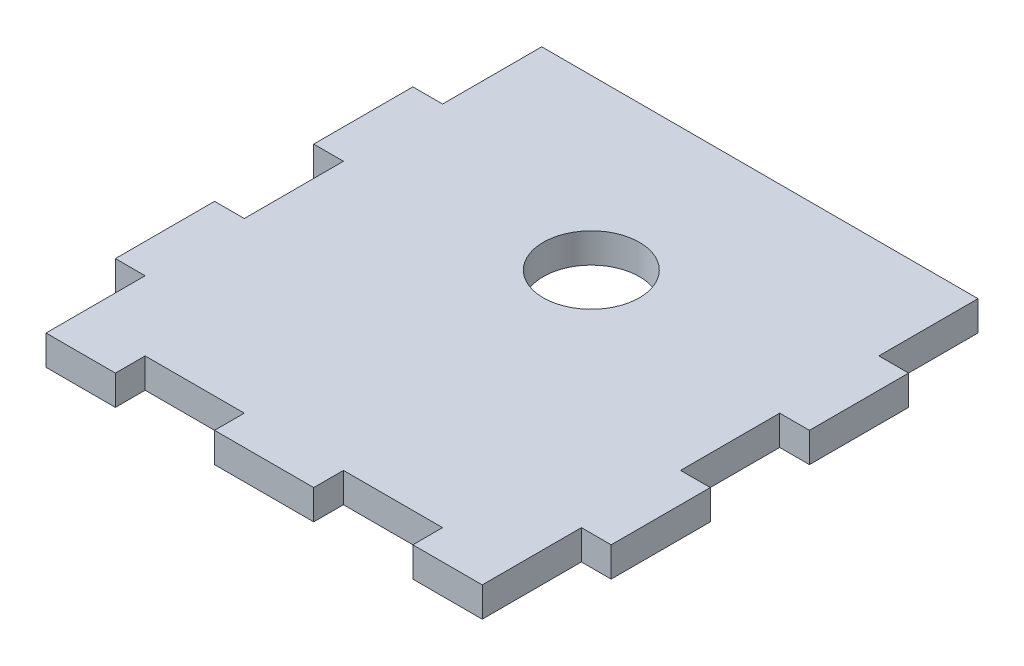
ISO-10303-21;
HEADER;
FILE_DESCRIPTION(('STEP AP214'),'2;1');
FILE_NAME('part.step','',(''),(''),'','','');
FILE_SCHEMA(('AUTOMOTIVE_DESIGN { 1 0 10303 214 1 1 1 1 }'));
ENDSEC;
DATA;
#1=APPLICATION_CONTEXT('core data for automotive mechanical design processes');
#2=APPLICATION_PROTOCOL_DEFINITION('international standard','automotive_design',2000,#1);
#3=PRODUCT_CONTEXT('',#1,'mechanical');
#4=PRODUCT('Part','Part','',(#3));
#5=PRODUCT_RELATED_PRODUCT_CATEGORY('part','',(#4));
#6=PRODUCT_DEFINITION_FORMATION('','',#4);
#7=PRODUCT_DEFINITION_CONTEXT('part definition',#1,'design');
#8=PRODUCT_DEFINITION('design','',#6,#7);
#9=PRODUCT_DEFINITION_SHAPE('','',#8);
#10=(LENGTH_UNIT() NAMED_UNIT(*) SI_UNIT(.MILLI.,.METRE.));
#11=(NAMED_UNIT(*) PLANE_ANGLE_UNIT() SI_UNIT($,.RADIAN.));
#12=(NAMED_UNIT(*) SI_UNIT($,.STERADIAN.) SOLID_ANGLE_UNIT());
#13=UNCERTAINTY_MEASURE_WITH_UNIT(LENGTH_MEASURE(1.E-05),#10,'distance_accuracy_value','');
#14=(GEOMETRIC_REPRESENTATION_CONTEXT(3) GLOBAL_UNCERTAINTY_ASSIGNED_CONTEXT((#13)) GLOBAL_UNIT_ASSIGNED_CONTEXT((#10,
#11,#12)) REPRESENTATION_CONTEXT('',''));
#15=CARTESIAN_POINT('',(0.,0.,0.));
#16=DIRECTION('',(0.,0.,1.));
#17=DIRECTION('',(1.,0.,0.));
#18=AXIS2_PLACEMENT_3D('',#15,#16,#17);
#19=CARTESIAN_POINT('',(40.,3.,0.));
#20=DIRECTION('',(1.,0.,0.));
#21=DIRECTION('',(0.,0.,-1.));
#22=AXIS2_PLACEMENT_3D('',#19,#20,#21);
#23=PLANE('',#22);
#24=DIRECTION('',(0.,0.,1.));
#25=VECTOR('',#24,1.);
#26=CARTESIAN_POINT('',(40.,0.,0.));
#27=LINE('',#26,#25);
#28=CARTESIAN_POINT('',(40.,0.,-3.));
#29=VERTEX_POINT('',#28);
#30=CARTESIAN_POINT('',(40.,0.,0.));
#31=VERTEX_POINT('',#30);
#32=EDGE_CURVE('E255',#29,#31,#27,.T.);
#33=ORIENTED_EDGE('',*,*,#32,.T.);
#34=DIRECTION('',(0.,-1.,0.));
#35=VECTOR('',#34,1.);
#36=CARTESIAN_POINT('',(40.,3.,0.));
#37=LINE('',#36,#35);
#38=CARTESIAN_POINT('',(40.,3.,0.));
#39=VERTEX_POINT('',#38);
#40=EDGE_CURVE('E11',#39,#31,#37,.T.);
#41=ORIENTED_EDGE('',*,*,#40,.F.);
#42=DIRECTION('',(0.,0.,1.));
#43=VECTOR('',#42,1.);
#44=CARTESIAN_POINT('',(40.,3.,0.));
#45=LINE('',#44,#43);
#46=CARTESIAN_POINT('',(40.,3.,-3.));
#47=VERTEX_POINT('',#46);
#48=EDGE_CURVE('E402',#47,#39,#45,.T.);
#49=ORIENTED_EDGE('',*,*,#48,.F.);
#50=DIRECTION('',(0.,-1.,0.));
#51=VECTOR('',#50,1.);
#52=CARTESIAN_POINT('',(40.,3.,-3.));
#53=LINE('',#52,#51);
#54=EDGE_CURVE('E251',#47,#29,#53,.T.);
#55=ORIENTED_EDGE('',*,*,#54,.T.);
#56=EDGE_LOOP('',(#33,#41,#49,#55));
#57=FACE_BOUND('',#56,.T.);
#58=ADVANCED_FACE('F33',(#57),#23,.F.);
#59=CARTESIAN_POINT('',(0.,3.,0.));
#60=DIRECTION('',(0.,0.,-1.));
#61=DIRECTION('',(-1.,0.,0.));
#62=AXIS2_PLACEMENT_3D('',#59,#60,#61);
#63=PLANE('',#62);
#64=DIRECTION('',(1.,0.,0.));
#65=VECTOR('',#64,1.);
#66=CARTESIAN_POINT('',(0.,0.,0.));
#67=LINE('',#66,#65);
#68=CARTESIAN_POINT('',(47.,0.,0.));
#69=VERTEX_POINT('',#68);
#70=EDGE_CURVE('E258',#31,#69,#67,.T.);
#71=ORIENTED_EDGE('',*,*,#70,.T.);
#72=DIRECTION('',(0.,-1.,0.));
#73=VECTOR('',#72,1.);
#74=CARTESIAN_POINT('',(47.,3.,0.));
#75=LINE('',#74,#73);
#76=CARTESIAN_POINT('',(47.,3.,0.));
#77=VERTEX_POINT('',#76);
#78=EDGE_CURVE('E42',#77,#69,#75,.T.);
#79=ORIENTED_EDGE('',*,*,#78,.F.);
#80=DIRECTION('',(1.,0.,0.));
#81=VECTOR('',#80,1.);
#82=CARTESIAN_POINT('',(0.,3.,0.));
#83=LINE('',#82,#81);
#84=EDGE_CURVE('E152',#39,#77,#83,.T.);
#85=ORIENTED_EDGE('',*,*,#84,.F.);
#86=ORIENTED_EDGE('',*,*,#40,.T.);
#87=EDGE_LOOP('',(#71,#79,#85,#86));
#88=FACE_BOUND('',#87,.T.);
#89=ADVANCED_FACE('F386',(#88),#63,.F.);
#90=CARTESIAN_POINT('',(47.,3.,0.));
#91=DIRECTION('',(1.,0.,0.));
#92=DIRECTION('',(0.,0.,-1.));
#93=AXIS2_PLACEMENT_3D('',#90,#91,#92);
#94=PLANE('',#93);
#95=DIRECTION('',(0.,0.,1.));
#96=VECTOR('',#95,1.);
#97=CARTESIAN_POINT('',(47.,0.,0.));
#98=LINE('',#97,#96);
#99=CARTESIAN_POINT('',(47.,0.,-10.));
#100=VERTEX_POINT('',#99);
#101=EDGE_CURVE('E261',#100,#69,#98,.T.);
#102=ORIENTED_EDGE('',*,*,#101,.F.);
#103=DIRECTION('',(0.,-1.,0.));
#104=VECTOR('',#103,1.);
#105=CARTESIAN_POINT('',(47.,3.,-10.));
#106=LINE('',#105,#104);
#107=CARTESIAN_POINT('',(47.,3.,-10.));
#108=VERTEX_POINT('',#107);
#109=EDGE_CURVE('E379',#108,#100,#106,.T.);
#110=ORIENTED_EDGE('',*,*,#109,.F.);
#111=DIRECTION('',(0.,0.,1.));
#112=VECTOR('',#111,1.);
#113=CARTESIAN_POINT('',(47.,3.,0.));
#114=LINE('',#113,#112);
#115=EDGE_CURVE('E385',#108,#77,#114,.T.);
#116=ORIENTED_EDGE('',*,*,#115,.T.);
#117=ORIENTED_EDGE('',*,*,#78,.T.);
#118=EDGE_LOOP('',(#102,#110,#116,#117));
#119=FACE_BOUND('',#118,.T.);
#120=ADVANCED_FACE('F383',(#119),#94,.T.);
#121=CARTESIAN_POINT('',(0.,3.,-10.));
#122=DIRECTION('',(0.,0.,1.));
#123=DIRECTION('',(1.,0.,0.));
#124=AXIS2_PLACEMENT_3D('',#121,#122,#123);
#125=PLANE('',#124);
#126=DIRECTION('',(-1.,0.,0.));
#127=VECTOR('',#126,1.);
#128=CARTESIAN_POINT('',(0.,0.,-10.));
#129=LINE('',#128,#127);
#130=CARTESIAN_POINT('',(50.,0.,-10.));
#131=VERTEX_POINT('',#130);
#132=EDGE_CURVE('E264',#131,#100,#129,.T.);
#133=ORIENTED_EDGE('',*,*,#132,.F.);
#134=DIRECTION('',(0.,-1.,0.));
#135=VECTOR('',#134,1.);
#136=CARTESIAN_POINT('',(50.,3.,-10.));
#137=LINE('',#136,#135);
#138=CARTESIAN_POINT('',(50.,3.,-10.));
#139=VERTEX_POINT('',#138);
#140=EDGE_CURVE('E377',#139,#131,#137,.T.);
#141=ORIENTED_EDGE('',*,*,#140,.F.);
#142=DIRECTION('',(-1.,0.,0.));
#143=VECTOR('',#142,1.);
#144=CARTESIAN_POINT('',(0.,3.,-10.));
#145=LINE('',#144,#143);
#146=EDGE_CURVE('E398',#139,#108,#145,.T.);
#147=ORIENTED_EDGE('',*,*,#146,.T.);
#148=ORIENTED_EDGE('',*,*,#109,.T.);
#149=EDGE_LOOP('',(#133,#141,#147,#148));
#150=FACE_BOUND('',#149,.T.);
#151=ADVANCED_FACE('F394',(#150),#125,.T.);
#152=CARTESIAN_POINT('',(50.,3.,0.));
#153=DIRECTION('',(-1.,0.,0.));
#154=DIRECTION('',(0.,0.,1.));
#155=AXIS2_PLACEMENT_3D('',#152,#153,#154);
#156=PLANE('',#155);
#157=DIRECTION('',(0.,0.,-1.));
#158=VECTOR('',#157,1.);
#159=CARTESIAN_POINT('',(50.,0.,0.));
#160=LINE('',#159,#158);
#161=CARTESIAN_POINT('',(50.,0.,-20.));
#162=VERTEX_POINT('',#161);
#163=EDGE_CURVE('E267',#131,#162,#160,.T.);
#164=ORIENTED_EDGE('',*,*,#163,.T.);
#165=DIRECTION('',(0.,-1.,0.));
#166=VECTOR('',#165,1.);
#167=CARTESIAN_POINT('',(50.,3.,-20.));
#168=LINE('',#167,#166);
#169=CARTESIAN_POINT('',(50.,3.,-20.));
#170=VERTEX_POINT('',#169);
#171=EDGE_CURVE('E375',#170,#162,#168,.T.);
#172=ORIENTED_EDGE('',*,*,#171,.F.);
#173=DIRECTION('',(0.,0.,-1.));
#174=VECTOR('',#173,1.);
#175=CARTESIAN_POINT('',(50.,3.,0.));
#176=LINE('',#175,#174);
#177=EDGE_CURVE('E400',#139,#170,#176,.T.);
#178=ORIENTED_EDGE('',*,*,#177,.F.);
#179=ORIENTED_EDGE('',*,*,#140,.T.);
#180=EDGE_LOOP('',(#164,#172,#178,#179));
#181=FACE_BOUND('',#180,.T.);
#182=ADVANCED_FACE('F481',(#181),#156,.F.);
#183=CARTESIAN_POINT('',(0.,3.,-20.));
#184=DIRECTION('',(0.,0.,-1.));
#185=DIRECTION('',(-1.,0.,0.));
#186=AXIS2_PLACEMENT_3D('',#183,#184,#185);
#187=PLANE('',#186);
#188=DIRECTION('',(1.,0.,0.));
#189=VECTOR('',#188,1.);
#190=CARTESIAN_POINT('',(0.,0.,-20.));
#191=LINE('',#190,#189);
#192=CARTESIAN_POINT('',(47.,0.,-20.));
#193=VERTEX_POINT('',#192);
#194=EDGE_CURVE('E270',#193,#162,#191,.T.);
#195=ORIENTED_EDGE('',*,*,#194,.F.);
#196=DIRECTION('',(0.,-1.,0.));
#197=VECTOR('',#196,1.);
#198=CARTESIAN_POINT('',(47.,3.,-20.));
#199=LINE('',#198,#197);
#200=CARTESIAN_POINT('',(47.,3.,-20.));
#201=VERTEX_POINT('',#200);
#202=EDGE_CURVE('E373',#201,#193,#199,.T.);
#203=ORIENTED_EDGE('',*,*,#202,.F.);
#204=DIRECTION('',(1.,0.,0.));
#205=VECTOR('',#204,1.);
#206=CARTESIAN_POINT('',(0.,3.,-20.));
#207=LINE('',#206,#205);
#208=EDGE_CURVE('E407',#201,#170,#207,.T.);
#209=ORIENTED_EDGE('',*,*,#208,.T.);
#210=ORIENTED_EDGE('',*,*,#171,.T.);
#211=EDGE_LOOP('',(#195,#203,#209,#210));
#212=FACE_BOUND('',#211,.T.);
#213=ADVANCED_FACE('F484',(#212),#187,.T.);
#214=CARTESIAN_POINT('',(47.,3.,0.));
#215=DIRECTION('',(-1.,0.,0.));
#216=DIRECTION('',(0.,0.,1.));
#217=AXIS2_PLACEMENT_3D('',#214,#215,#216);
#218=PLANE('',#217);
#219=DIRECTION('',(0.,0.,-1.));
#220=VECTOR('',#219,1.);
#221=CARTESIAN_POINT('',(47.,0.,0.));
#222=LINE('',#221,#220);
#223=CARTESIAN_POINT('',(47.,0.,-30.));
#224=VERTEX_POINT('',#223);
#225=EDGE_CURVE('E273',#193,#224,#222,.T.);
#226=ORIENTED_EDGE('',*,*,#225,.T.);
#227=DIRECTION('',(0.,-1.,0.));
#228=VECTOR('',#227,1.);
#229=CARTESIAN_POINT('',(47.,3.,-30.));
#230=LINE('',#229,#228);
#231=CARTESIAN_POINT('',(47.,3.,-30.));
#232=VERTEX_POINT('',#231);
#233=EDGE_CURVE('E370',#232,#224,#230,.T.);
#234=ORIENTED_EDGE('',*,*,#233,.F.);
#235=DIRECTION('',(0.,0.,-1.));
#236=VECTOR('',#235,1.);
#237=CARTESIAN_POINT('',(47.,3.,0.));
#238=LINE('',#237,#236);
#239=EDGE_CURVE('E410',#201,#232,#238,.T.);
#240=ORIENTED_EDGE('',*,*,#239,.F.);
#241=ORIENTED_EDGE('',*,*,#202,.T.);
#242=EDGE_LOOP('',(#226,#234,#240,#241));
#243=FACE_BOUND('',#242,.T.);
#244=ADVANCED_FACE('F488',(#243),#218,.F.);
#245=CARTESIAN_POINT('',(0.,3.,-30.));
#246=DIRECTION('',(0.,0.,-1.));
#247=DIRECTION('',(-1.,0.,0.));
#248=AXIS2_PLACEMENT_3D('',#245,#246,#247);
#249=PLANE('',#248);
#250=DIRECTION('',(1.,0.,0.));
#251=VECTOR('',#250,1.);
#252=CARTESIAN_POINT('',(0.,0.,-30.));
#253=LINE('',#252,#251);
#254=CARTESIAN_POINT('',(50.,0.,-30.));
#255=VERTEX_POINT('',#254);
#256=EDGE_CURVE('E275',#224,#255,#253,.T.);
#257=ORIENTED_EDGE('',*,*,#256,.T.);
#258=DIRECTION('',(0.,-1.,0.));
#259=VECTOR('',#258,1.);
#260=CARTESIAN_POINT('',(50.,3.,-30.));
#261=LINE('',#260,#259);
#262=CARTESIAN_POINT('',(50.,3.,-30.));
#263=VERTEX_POINT('',#262);
#264=EDGE_CURVE('E367',#263,#255,#261,.T.);
#265=ORIENTED_EDGE('',*,*,#264,.F.);
#266=DIRECTION('',(1.,0.,0.));
#267=VECTOR('',#266,1.);
#268=CARTESIAN_POINT('',(0.,3.,-30.));
#269=LINE('',#268,#267);
#270=EDGE_CURVE('E412',#232,#263,#269,.T.);
#271=ORIENTED_EDGE('',*,*,#270,.F.);
#272=ORIENTED_EDGE('',*,*,#233,.T.);
#273=EDGE_LOOP('',(#257,#265,#271,#272));
#274=FACE_BOUND('',#273,.T.);
#275=ADVANCED_FACE('F492',(#274),#249,.F.);
#276=CARTESIAN_POINT('',(50.,3.,0.));
#277=DIRECTION('',(-1.,0.,0.));
#278=DIRECTION('',(0.,0.,1.));
#279=AXIS2_PLACEMENT_3D('',#276,#277,#278);
#280=PLANE('',#279);
#281=DIRECTION('',(0.,0.,-1.));
#282=VECTOR('',#281,1.);
#283=CARTESIAN_POINT('',(50.,0.,0.));
#284=LINE('',#283,#282);
#285=CARTESIAN_POINT('',(50.,0.,-40.));
#286=VERTEX_POINT('',#285);
#287=EDGE_CURVE('E277',#255,#286,#284,.T.);
#288=ORIENTED_EDGE('',*,*,#287,.T.);
#289=DIRECTION('',(0.,-1.,0.));
#290=VECTOR('',#289,1.);
#291=CARTESIAN_POINT('',(50.,3.,-40.));
#292=LINE('',#291,#290);
#293=CARTESIAN_POINT('',(50.,3.,-40.));
#294=VERTEX_POINT('',#293);
#295=EDGE_CURVE('E364',#294,#286,#292,.T.);
#296=ORIENTED_EDGE('',*,*,#295,.F.);
#297=DIRECTION('',(0.,0.,-1.));
#298=VECTOR('',#297,1.);
#299=CARTESIAN_POINT('',(50.,3.,0.));
#300=LINE('',#299,#298);
#301=EDGE_CURVE('E414',#263,#294,#300,.T.);
#302=ORIENTED_EDGE('',*,*,#301,.F.);
#303=ORIENTED_EDGE('',*,*,#264,.T.);
#304=EDGE_LOOP('',(#288,#296,#302,#303));
#305=FACE_BOUND('',#304,.T.);
#306=ADVANCED_FACE('F496',(#305),#280,.F.);
#307=CARTESIAN_POINT('',(0.,3.,-40.));
#308=DIRECTION('',(0.,0.,1.));
#309=DIRECTION('',(1.,0.,0.));
#310=AXIS2_PLACEMENT_3D('',#307,#308,#309);
#311=PLANE('',#310);
#312=DIRECTION('',(-1.,0.,0.));
#313=VECTOR('',#312,1.);
#314=CARTESIAN_POINT('',(0.,0.,-40.));
#315=LINE('',#314,#313);
#316=CARTESIAN_POINT('',(47.,0.,-40.));
#317=VERTEX_POINT('',#316);
#318=EDGE_CURVE('E279',#286,#317,#315,.T.);
#319=ORIENTED_EDGE('',*,*,#318,.T.);
#320=DIRECTION('',(0.,-1.,0.));
#321=VECTOR('',#320,1.);
#322=CARTESIAN_POINT('',(47.,3.,-40.));
#323=LINE('',#322,#321);
#324=CARTESIAN_POINT('',(47.,3.,-40.));
#325=VERTEX_POINT('',#324);
#326=EDGE_CURVE('E361',#325,#317,#323,.T.);
#327=ORIENTED_EDGE('',*,*,#326,.F.);
#328=DIRECTION('',(-1.,0.,0.));
#329=VECTOR('',#328,1.);
#330=CARTESIAN_POINT('',(0.,3.,-40.));
#331=LINE('',#330,#329);
#332=EDGE_CURVE('E416',#294,#325,#331,.T.);
#333=ORIENTED_EDGE('',*,*,#332,.F.);
#334=ORIENTED_EDGE('',*,*,#295,.T.);
#335=EDGE_LOOP('',(#319,#327,#333,#334));
#336=FACE_BOUND('',#335,.T.);
#337=ADVANCED_FACE('F500',(#336),#311,.F.);
#338=CARTESIAN_POINT('',(47.,3.,0.));
#339=DIRECTION('',(-1.,0.,0.));
#340=DIRECTION('',(0.,0.,1.));
#341=AXIS2_PLACEMENT_3D('',#338,#339,#340);
#342=PLANE('',#341);
#343=DIRECTION('',(0.,0.,-1.));
#344=VECTOR('',#343,1.);
#345=CARTESIAN_POINT('',(47.,0.,0.));
#346=LINE('',#345,#344);
#347=CARTESIAN_POINT('',(47.,0.,-50.));
#348=VERTEX_POINT('',#347);
#349=EDGE_CURVE('E281',#317,#348,#346,.T.);
#350=ORIENTED_EDGE('',*,*,#349,.T.);
#351=DIRECTION('',(0.,-1.,0.));
#352=VECTOR('',#351,1.);
#353=CARTESIAN_POINT('',(47.,3.,-50.));
#354=LINE('',#353,#352);
#355=CARTESIAN_POINT('',(47.,3.,-50.));
#356=VERTEX_POINT('',#355);
#357=EDGE_CURVE('E358',#356,#348,#354,.T.);
#358=ORIENTED_EDGE('',*,*,#357,.F.);
#359=DIRECTION('',(0.,0.,-1.));
#360=VECTOR('',#359,1.);
#361=CARTESIAN_POINT('',(47.,3.,0.));
#362=LINE('',#361,#360);
#363=EDGE_CURVE('E418',#325,#356,#362,.T.);
#364=ORIENTED_EDGE('',*,*,#363,.F.);
#365=ORIENTED_EDGE('',*,*,#326,.T.);
#366=EDGE_LOOP('',(#350,#358,#364,#365));
#367=FACE_BOUND('',#366,.T.);
#368=ADVANCED_FACE('F504',(#367),#342,.F.);
#369=CARTESIAN_POINT('',(0.,3.,-50.));
#370=DIRECTION('',(0.,0.,1.));
#371=DIRECTION('',(1.,0.,0.));
#372=AXIS2_PLACEMENT_3D('',#369,#370,#371);
#373=PLANE('',#372);
#374=DIRECTION('',(-1.,0.,0.));
#375=VECTOR('',#374,1.);
#376=CARTESIAN_POINT('',(0.,0.,-50.));
#377=LINE('',#376,#375);
#378=CARTESIAN_POINT('',(3.,0.,-50.));
#379=VERTEX_POINT('',#378);
#380=EDGE_CURVE('E283',#348,#379,#377,.T.);
#381=ORIENTED_EDGE('',*,*,#380,.T.);
#382=DIRECTION('',(0.,-1.,0.));
#383=VECTOR('',#382,1.);
#384=CARTESIAN_POINT('',(3.,3.,-50.));
#385=LINE('',#384,#383);
#386=CARTESIAN_POINT('',(3.,3.,-50.));
#387=VERTEX_POINT('',#386);
#388=EDGE_CURVE('E356',#387,#379,#385,.T.);
#389=ORIENTED_EDGE('',*,*,#388,.F.);
#390=DIRECTION('',(-1.,0.,0.));
#391=VECTOR('',#390,1.);
#392=CARTESIAN_POINT('',(0.,3.,-50.));
#393=LINE('',#392,#391);
#394=EDGE_CURVE('E420',#356,#387,#393,.T.);
#395=ORIENTED_EDGE('',*,*,#394,.F.);
#396=ORIENTED_EDGE('',*,*,#357,.T.);
#397=EDGE_LOOP('',(#381,#389,#395,#396));
#398=FACE_BOUND('',#397,.T.);
#399=ADVANCED_FACE('F508',(#398),#373,.F.);
#400=CARTESIAN_POINT('',(3.,3.,0.));
#401=DIRECTION('',(-1.,0.,0.));
#402=DIRECTION('',(0.,0.,1.));
#403=AXIS2_PLACEMENT_3D('',#400,#401,#402);
#404=PLANE('',#403);
#405=DIRECTION('',(0.,0.,-1.));
#406=VECTOR('',#405,1.);
#407=CARTESIAN_POINT('',(3.,0.,0.));
#408=LINE('',#407,#406);
#409=CARTESIAN_POINT('',(3.,0.,-40.));
#410=VERTEX_POINT('',#409);
#411=EDGE_CURVE('E286',#410,#379,#408,.T.);
#412=ORIENTED_EDGE('',*,*,#411,.F.);
#413=DIRECTION('',(0.,-1.,0.));
#414=VECTOR('',#413,1.);
#415=CARTESIAN_POINT('',(3.,3.,-40.));
#416=LINE('',#415,#414);
#417=CARTESIAN_POINT('',(3.,3.,-40.));
#418=VERTEX_POINT('',#417);
#419=EDGE_CURVE('E354',#418,#410,#416,.T.);
#420=ORIENTED_EDGE('',*,*,#419,.F.);
#421=DIRECTION('',(0.,0.,-1.));
#422=VECTOR('',#421,1.);
#423=CARTESIAN_POINT('',(3.,3.,0.));
#424=LINE('',#423,#422);
#425=EDGE_CURVE('E422',#418,#387,#424,.T.);
#426=ORIENTED_EDGE('',*,*,#425,.T.);
#427=ORIENTED_EDGE('',*,*,#388,.T.);
#428=EDGE_LOOP('',(#412,#420,#426,#427));
#429=FACE_BOUND('',#428,.T.);
#430=ADVANCED_FACE('F512',(#429),#404,.T.);
#431=CARTESIAN_POINT('',(0.,3.,-40.));
#432=DIRECTION('',(0.,0.,-1.));
#433=DIRECTION('',(-1.,0.,0.));
#434=AXIS2_PLACEMENT_3D('',#431,#432,#433);
#435=PLANE('',#434);
#436=DIRECTION('',(1.,0.,0.));
#437=VECTOR('',#436,1.);
#438=CARTESIAN_POINT('',(0.,0.,-40.));
#439=LINE('',#438,#437);
#440=CARTESIAN_POINT('',(0.,0.,-40.));
#441=VERTEX_POINT('',#440);
#442=EDGE_CURVE('E289',#441,#410,#439,.T.);
#443=ORIENTED_EDGE('',*,*,#442,.F.);
#444=DIRECTION('',(0.,-1.,0.));
#445=VECTOR('',#444,1.);
#446=CARTESIAN_POINT('',(0.,3.,-40.));
#447=LINE('',#446,#445);
#448=CARTESIAN_POINT('',(0.,3.,-40.));
#449=VERTEX_POINT('',#448);
#450=EDGE_CURVE('E352',#449,#441,#447,.T.);
#451=ORIENTED_EDGE('',*,*,#450,.F.);
#452=DIRECTION('',(1.,0.,0.));
#453=VECTOR('',#452,1.);
#454=CARTESIAN_POINT('',(0.,3.,-40.));
#455=LINE('',#454,#453);
#456=EDGE_CURVE('E425',#449,#418,#455,.T.);
#457=ORIENTED_EDGE('',*,*,#456,.T.);
#458=ORIENTED_EDGE('',*,*,#419,.T.);
#459=EDGE_LOOP('',(#443,#451,#457,#458));
#460=FACE_BOUND('',#459,.T.);
#461=ADVANCED_FACE('F516',(#460),#435,.T.);
#462=CARTESIAN_POINT('',(0.,3.,0.));
#463=DIRECTION('',(1.,0.,0.));
#464=DIRECTION('',(0.,0.,-1.));
#465=AXIS2_PLACEMENT_3D('',#462,#463,#464);
#466=PLANE('',#465);
#467=DIRECTION('',(0.,0.,1.));
#468=VECTOR('',#467,1.);
#469=CARTESIAN_POINT('',(0.,0.,0.));
#470=LINE('',#469,#468);
#471=CARTESIAN_POINT('',(0.,0.,-30.));
#472=VERTEX_POINT('',#471);
#473=EDGE_CURVE('E292',#441,#472,#470,.T.);
#474=ORIENTED_EDGE('',*,*,#473,.T.);
#475=DIRECTION('',(0.,-1.,0.));
#476=VECTOR('',#475,1.);
#477=CARTESIAN_POINT('',(0.,3.,-30.));
#478=LINE('',#477,#476);
#479=CARTESIAN_POINT('',(0.,3.,-30.));
#480=VERTEX_POINT('',#479);
#481=EDGE_CURVE('E350',#480,#472,#478,.T.);
#482=ORIENTED_EDGE('',*,*,#481,.F.);
#483=DIRECTION('',(0.,0.,1.));
#484=VECTOR('',#483,1.);
#485=CARTESIAN_POINT('',(0.,3.,0.));
#486=LINE('',#485,#484);
#487=EDGE_CURVE('E428',#449,#480,#486,.T.);
#488=ORIENTED_EDGE('',*,*,#487,.F.);
#489=ORIENTED_EDGE('',*,*,#450,.T.);
#490=EDGE_LOOP('',(#474,#482,#488,#489));
#491=FACE_BOUND('',#490,.T.);
#492=ADVANCED_FACE('F520',(#491),#466,.F.);
#493=CARTESIAN_POINT('',(0.,3.,-30.));
#494=DIRECTION('',(0.,0.,1.));
#495=DIRECTION('',(1.,0.,0.));
#496=AXIS2_PLACEMENT_3D('',#493,#494,#495);
#497=PLANE('',#496);
#498=DIRECTION('',(-1.,0.,0.));
#499=VECTOR('',#498,1.);
#500=CARTESIAN_POINT('',(0.,0.,-30.));
#501=LINE('',#500,#499);
#502=CARTESIAN_POINT('',(3.,0.,-30.));
#503=VERTEX_POINT('',#502);
#504=EDGE_CURVE('E295',#503,#472,#501,.T.);
#505=ORIENTED_EDGE('',*,*,#504,.F.);
#506=DIRECTION('',(0.,-1.,0.));
#507=VECTOR('',#506,1.);
#508=CARTESIAN_POINT('',(3.,3.,-30.));
#509=LINE('',#508,#507);
#510=CARTESIAN_POINT('',(3.,3.,-30.));
#511=VERTEX_POINT('',#510);
#512=EDGE_CURVE('E348',#511,#503,#509,.T.);
#513=ORIENTED_EDGE('',*,*,#512,.F.);
#514=DIRECTION('',(-1.,0.,0.));
#515=VECTOR('',#514,1.);
#516=CARTESIAN_POINT('',(0.,3.,-30.));
#517=LINE('',#516,#515);
#518=EDGE_CURVE('E430',#511,#480,#517,.T.);
#519=ORIENTED_EDGE('',*,*,#518,.T.);
#520=ORIENTED_EDGE('',*,*,#481,.T.);
#521=EDGE_LOOP('',(#505,#513,#519,#520));
#522=FACE_BOUND('',#521,.T.);
#523=ADVANCED_FACE('F524',(#522),#497,.T.);
#524=CARTESIAN_POINT('',(3.,3.,0.));
#525=DIRECTION('',(-1.,0.,0.));
#526=DIRECTION('',(0.,0.,1.));
#527=AXIS2_PLACEMENT_3D('',#524,#525,#526);
#528=PLANE('',#527);
#529=DIRECTION('',(0.,0.,-1.));
#530=VECTOR('',#529,1.);
#531=CARTESIAN_POINT('',(3.,0.,0.));
#532=LINE('',#531,#530);
#533=CARTESIAN_POINT('',(3.,0.,-20.));
#534=VERTEX_POINT('',#533);
#535=EDGE_CURVE('E298',#534,#503,#532,.T.);
#536=ORIENTED_EDGE('',*,*,#535,.F.);
#537=DIRECTION('',(0.,-1.,0.));
#538=VECTOR('',#537,1.);
#539=CARTESIAN_POINT('',(3.,3.,-20.));
#540=LINE('',#539,#538);
#541=CARTESIAN_POINT('',(3.,3.,-20.));
#542=VERTEX_POINT('',#541);
#543=EDGE_CURVE('E346',#542,#534,#540,.T.);
#544=ORIENTED_EDGE('',*,*,#543,.F.);
#545=DIRECTION('',(0.,0.,-1.));
#546=VECTOR('',#545,1.);
#547=CARTESIAN_POINT('',(3.,3.,0.));
#548=LINE('',#547,#546);
#549=EDGE_CURVE('E433',#542,#511,#548,.T.);
#550=ORIENTED_EDGE('',*,*,#549,.T.);
#551=ORIENTED_EDGE('',*,*,#512,.T.);
#552=EDGE_LOOP('',(#536,#544,#550,#551));
#553=FACE_BOUND('',#552,.T.);
#554=ADVANCED_FACE('F528',(#553),#528,.T.);
#555=CARTESIAN_POINT('',(0.,3.,-20.));
#556=DIRECTION('',(0.,0.,1.));
#557=DIRECTION('',(1.,0.,0.));
#558=AXIS2_PLACEMENT_3D('',#555,#556,#557);
#559=PLANE('',#558);
#560=DIRECTION('',(-1.,0.,0.));
#561=VECTOR('',#560,1.);
#562=CARTESIAN_POINT('',(0.,0.,-20.));
#563=LINE('',#562,#561);
#564=CARTESIAN_POINT('',(0.,0.,-20.));
#565=VERTEX_POINT('',#564);
#566=EDGE_CURVE('E301',#534,#565,#563,.T.);
#567=ORIENTED_EDGE('',*,*,#566,.T.);
#568=DIRECTION('',(0.,-1.,0.));
#569=VECTOR('',#568,1.);
#570=CARTESIAN_POINT('',(0.,3.,-20.));
#571=LINE('',#570,#569);
#572=CARTESIAN_POINT('',(0.,3.,-20.));
#573=VERTEX_POINT('',#572);
#574=EDGE_CURVE('E343',#573,#565,#571,.T.);
#575=ORIENTED_EDGE('',*,*,#574,.F.);
#576=DIRECTION('',(-1.,0.,0.));
#577=VECTOR('',#576,1.);
#578=CARTESIAN_POINT('',(0.,3.,-20.));
#579=LINE('',#578,#577);
#580=EDGE_CURVE('E436',#542,#573,#579,.T.);
#581=ORIENTED_EDGE('',*,*,#580,.F.);
#582=ORIENTED_EDGE('',*,*,#543,.T.);
#583=EDGE_LOOP('',(#567,#575,#581,#582));
#584=FACE_BOUND('',#583,.T.);
#585=ADVANCED_FACE('F532',(#584),#559,.F.);
#586=CARTESIAN_POINT('',(0.,3.,0.));
#587=DIRECTION('',(1.,0.,0.));
#588=DIRECTION('',(0.,0.,-1.));
#589=AXIS2_PLACEMENT_3D('',#586,#587,#588);
#590=PLANE('',#589);
#591=DIRECTION('',(0.,0.,1.));
#592=VECTOR('',#591,1.);
#593=CARTESIAN_POINT('',(0.,0.,0.));
#594=LINE('',#593,#592);
#595=CARTESIAN_POINT('',(0.,0.,-10.));
#596=VERTEX_POINT('',#595);
#597=EDGE_CURVE('E303',#565,#596,#594,.T.);
#598=ORIENTED_EDGE('',*,*,#597,.T.);
#599=DIRECTION('',(0.,-1.,0.));
#600=VECTOR('',#599,1.);
#601=CARTESIAN_POINT('',(0.,3.,-10.));
#602=LINE('',#601,#600);
#603=CARTESIAN_POINT('',(0.,3.,-10.));
#604=VERTEX_POINT('',#603);
#605=EDGE_CURVE('E340',#604,#596,#602,.T.);
#606=ORIENTED_EDGE('',*,*,#605,.F.);
#607=DIRECTION('',(0.,0.,1.));
#608=VECTOR('',#607,1.);
#609=CARTESIAN_POINT('',(0.,3.,0.));
#610=LINE('',#609,#608);
#611=EDGE_CURVE('E438',#573,#604,#610,.T.);
#612=ORIENTED_EDGE('',*,*,#611,.F.);
#613=ORIENTED_EDGE('',*,*,#574,.T.);
#614=EDGE_LOOP('',(#598,#606,#612,#613));
#615=FACE_BOUND('',#614,.T.);
#616=ADVANCED_FACE('F536',(#615),#590,.F.);
#617=CARTESIAN_POINT('',(0.,3.,-10.));
#618=DIRECTION('',(0.,0.,-1.));
#619=DIRECTION('',(-1.,0.,0.));
#620=AXIS2_PLACEMENT_3D('',#617,#618,#619);
#621=PLANE('',#620);
#622=DIRECTION('',(1.,0.,0.));
#623=VECTOR('',#622,1.);
#624=CARTESIAN_POINT('',(0.,0.,-10.));
#625=LINE('',#624,#623);
#626=CARTESIAN_POINT('',(3.,0.,-10.));
#627=VERTEX_POINT('',#626);
#628=EDGE_CURVE('E305',#596,#627,#625,.T.);
#629=ORIENTED_EDGE('',*,*,#628,.T.);
#630=DIRECTION('',(0.,-1.,0.));
#631=VECTOR('',#630,1.);
#632=CARTESIAN_POINT('',(3.,3.,-10.));
#633=LINE('',#632,#631);
#634=CARTESIAN_POINT('',(3.,3.,-10.));
#635=VERTEX_POINT('',#634);
#636=EDGE_CURVE('E337',#635,#627,#633,.T.);
#637=ORIENTED_EDGE('',*,*,#636,.F.);
#638=DIRECTION('',(1.,0.,0.));
#639=VECTOR('',#638,1.);
#640=CARTESIAN_POINT('',(0.,3.,-10.));
#641=LINE('',#640,#639);
#642=EDGE_CURVE('E440',#604,#635,#641,.T.);
#643=ORIENTED_EDGE('',*,*,#642,.F.);
#644=ORIENTED_EDGE('',*,*,#605,.T.);
#645=EDGE_LOOP('',(#629,#637,#643,#644));
#646=FACE_BOUND('',#645,.T.);
#647=ADVANCED_FACE('F540',(#646),#621,.F.);
#648=CARTESIAN_POINT('',(3.,3.,0.));
#649=DIRECTION('',(1.,0.,0.));
#650=DIRECTION('',(0.,0.,-1.));
#651=AXIS2_PLACEMENT_3D('',#648,#649,#650);
#652=PLANE('',#651);
#653=DIRECTION('',(0.,0.,1.));
#654=VECTOR('',#653,1.);
#655=CARTESIAN_POINT('',(3.,0.,0.));
#656=LINE('',#655,#654);
#657=CARTESIAN_POINT('',(3.,0.,0.));
#658=VERTEX_POINT('',#657);
#659=EDGE_CURVE('E307',#627,#658,#656,.T.);
#660=ORIENTED_EDGE('',*,*,#659,.T.);
#661=DIRECTION('',(0.,-1.,0.));
#662=VECTOR('',#661,1.);
#663=CARTESIAN_POINT('',(3.,3.,0.));
#664=LINE('',#663,#662);
#665=CARTESIAN_POINT('',(3.,3.,0.));
#666=VERTEX_POINT('',#665);
#667=EDGE_CURVE('E334',#666,#658,#664,.T.);
#668=ORIENTED_EDGE('',*,*,#667,.F.);
#669=DIRECTION('',(0.,0.,1.));
#670=VECTOR('',#669,1.);
#671=CARTESIAN_POINT('',(3.,3.,0.));
#672=LINE('',#671,#670);
#673=EDGE_CURVE('E442',#635,#666,#672,.T.);
#674=ORIENTED_EDGE('',*,*,#673,.F.);
#675=ORIENTED_EDGE('',*,*,#636,.T.);
#676=EDGE_LOOP('',(#660,#668,#674,#675));
#677=FACE_BOUND('',#676,.T.);
#678=ADVANCED_FACE('F544',(#677),#652,.F.);
#679=CARTESIAN_POINT('',(0.,3.,0.));
#680=DIRECTION('',(0.,0.,-1.));
#681=DIRECTION('',(-1.,0.,0.));
#682=AXIS2_PLACEMENT_3D('',#679,#680,#681);
#683=PLANE('',#682);
#684=DIRECTION('',(1.,0.,0.));
#685=VECTOR('',#684,1.);
#686=CARTESIAN_POINT('',(0.,0.,0.));
#687=LINE('',#686,#685);
#688=CARTESIAN_POINT('',(10.,0.,0.));
#689=VERTEX_POINT('',#688);
#690=EDGE_CURVE('E309',#658,#689,#687,.T.);
#691=ORIENTED_EDGE('',*,*,#690,.T.);
#692=DIRECTION('',(0.,-1.,0.));
#693=VECTOR('',#692,1.);
#694=CARTESIAN_POINT('',(10.,3.,0.));
#695=LINE('',#694,#693);
#696=CARTESIAN_POINT('',(10.,3.,0.));
#697=VERTEX_POINT('',#696);
#698=EDGE_CURVE('E332',#697,#689,#695,.T.);
#699=ORIENTED_EDGE('',*,*,#698,.F.);
#700=DIRECTION('',(1.,0.,0.));
#701=VECTOR('',#700,1.);
#702=CARTESIAN_POINT('',(0.,3.,0.));
#703=LINE('',#702,#701);
#704=EDGE_CURVE('E444',#666,#697,#703,.T.);
#705=ORIENTED_EDGE('',*,*,#704,.F.);
#706=ORIENTED_EDGE('',*,*,#667,.T.);
#707=EDGE_LOOP('',(#691,#699,#705,#706));
#708=FACE_BOUND('',#707,.T.);
#709=ADVANCED_FACE('F548',(#708),#683,.F.);
#710=CARTESIAN_POINT('',(10.,3.,0.));
#711=DIRECTION('',(1.,0.,0.));
#712=DIRECTION('',(0.,0.,-1.));
#713=AXIS2_PLACEMENT_3D('',#710,#711,#712);
#714=PLANE('',#713);
#715=DIRECTION('',(0.,0.,1.));
#716=VECTOR('',#715,1.);
#717=CARTESIAN_POINT('',(10.,0.,0.));
#718=LINE('',#717,#716);
#719=CARTESIAN_POINT('',(10.,0.,-3.));
#720=VERTEX_POINT('',#719);
#721=EDGE_CURVE('E312',#720,#689,#718,.T.);
#722=ORIENTED_EDGE('',*,*,#721,.F.);
#723=DIRECTION('',(0.,-1.,0.));
#724=VECTOR('',#723,1.);
#725=CARTESIAN_POINT('',(10.,3.,-3.));
#726=LINE('',#725,#724);
#727=CARTESIAN_POINT('',(10.,3.,-3.));
#728=VERTEX_POINT('',#727);
#729=EDGE_CURVE('E330',#728,#720,#726,.T.);
#730=ORIENTED_EDGE('',*,*,#729,.F.);
#731=DIRECTION('',(0.,0.,1.));
#732=VECTOR('',#731,1.);
#733=CARTESIAN_POINT('',(10.,3.,0.));
#734=LINE('',#733,#732);
#735=EDGE_CURVE('E446',#728,#697,#734,.T.);
#736=ORIENTED_EDGE('',*,*,#735,.T.);
#737=ORIENTED_EDGE('',*,*,#698,.T.);
#738=EDGE_LOOP('',(#722,#730,#736,#737));
#739=FACE_BOUND('',#738,.T.);
#740=ADVANCED_FACE('F552',(#739),#714,.T.);
#741=CARTESIAN_POINT('',(0.,3.,-3.));
#742=DIRECTION('',(0.,0.,1.));
#743=DIRECTION('',(1.,0.,0.));
#744=AXIS2_PLACEMENT_3D('',#741,#742,#743);
#745=PLANE('',#744);
#746=DIRECTION('',(-1.,0.,0.));
#747=VECTOR('',#746,1.);
#748=CARTESIAN_POINT('',(0.,0.,-3.));
#749=LINE('',#748,#747);
#750=CARTESIAN_POINT('',(20.,0.,-3.));
#751=VERTEX_POINT('',#750);
#752=EDGE_CURVE('E315',#751,#720,#749,.T.);
#753=ORIENTED_EDGE('',*,*,#752,.F.);
#754=DIRECTION('',(0.,-1.,0.));
#755=VECTOR('',#754,1.);
#756=CARTESIAN_POINT('',(20.,3.,-3.));
#757=LINE('',#756,#755);
#758=CARTESIAN_POINT('',(20.,3.,-3.));
#759=VERTEX_POINT('',#758);
#760=EDGE_CURVE('E328',#759,#751,#757,.T.);
#761=ORIENTED_EDGE('',*,*,#760,.F.);
#762=DIRECTION('',(-1.,0.,0.));
#763=VECTOR('',#762,1.);
#764=CARTESIAN_POINT('',(0.,3.,-3.));
#765=LINE('',#764,#763);
#766=EDGE_CURVE('E246',#759,#728,#765,.T.);
#767=ORIENTED_EDGE('',*,*,#766,.T.);
#768=ORIENTED_EDGE('',*,*,#729,.T.);
#769=EDGE_LOOP('',(#753,#761,#767,#768));
#770=FACE_BOUND('',#769,.T.);
#771=ADVANCED_FACE('F451',(#770),#745,.T.);
#772=CARTESIAN_POINT('',(20.,3.,0.));
#773=DIRECTION('',(-1.,0.,0.));
#774=DIRECTION('',(0.,0.,1.));
#775=AXIS2_PLACEMENT_3D('',#772,#773,#774);
#776=PLANE('',#775);
#777=DIRECTION('',(0.,0.,-1.));
#778=VECTOR('',#777,1.);
#779=CARTESIAN_POINT('',(20.,0.,0.));
#780=LINE('',#779,#778);
#781=CARTESIAN_POINT('',(20.,0.,0.));
#782=VERTEX_POINT('',#781);
#783=EDGE_CURVE('E318',#782,#751,#780,.T.);
#784=ORIENTED_EDGE('',*,*,#783,.F.);
#785=DIRECTION('',(0.,-1.,0.));
#786=VECTOR('',#785,1.);
#787=CARTESIAN_POINT('',(20.,3.,0.));
#788=LINE('',#787,#786);
#789=CARTESIAN_POINT('',(20.,3.,0.));
#790=VERTEX_POINT('',#789);
#791=EDGE_CURVE('E234',#790,#782,#788,.T.);
#792=ORIENTED_EDGE('',*,*,#791,.F.);
#793=DIRECTION('',(0.,0.,-1.));
#794=VECTOR('',#793,1.);
#795=CARTESIAN_POINT('',(20.,3.,0.));
#796=LINE('',#795,#794);
#797=EDGE_CURVE('E244',#790,#759,#796,.T.);
#798=ORIENTED_EDGE('',*,*,#797,.T.);
#799=ORIENTED_EDGE('',*,*,#760,.T.);
#800=EDGE_LOOP('',(#784,#792,#798,#799));
#801=FACE_BOUND('',#800,.T.);
#802=ADVANCED_FACE('F456',(#801),#776,.T.);
#803=CARTESIAN_POINT('',(0.,3.,0.));
#804=DIRECTION('',(0.,0.,1.));
#805=DIRECTION('',(1.,0.,0.));
#806=AXIS2_PLACEMENT_3D('',#803,#804,#805);
#807=PLANE('',#806);
#808=DIRECTION('',(-1.,0.,0.));
#809=VECTOR('',#808,1.);
#810=CARTESIAN_POINT('',(0.,0.,0.));
#811=LINE('',#810,#809);
#812=CARTESIAN_POINT('',(30.,0.,0.));
#813=VERTEX_POINT('',#812);
#814=EDGE_CURVE('E233',#813,#782,#811,.T.);
#815=ORIENTED_EDGE('',*,*,#814,.F.);
#816=DIRECTION('',(0.,-1.,0.));
#817=VECTOR('',#816,1.);
#818=CARTESIAN_POINT('',(30.,3.,0.));
#819=LINE('',#818,#817);
#820=CARTESIAN_POINT('',(30.,3.,0.));
#821=VERTEX_POINT('',#820);
#822=EDGE_CURVE('E227',#821,#813,#819,.T.);
#823=ORIENTED_EDGE('',*,*,#822,.F.);
#824=DIRECTION('',(-1.,0.,0.));
#825=VECTOR('',#824,1.);
#826=CARTESIAN_POINT('',(0.,3.,0.));
#827=LINE('',#826,#825);
#828=EDGE_CURVE('E231',#821,#790,#827,.T.);
#829=ORIENTED_EDGE('',*,*,#828,.T.);
#830=ORIENTED_EDGE('',*,*,#791,.T.);
#831=EDGE_LOOP('',(#815,#823,#829,#830));
#832=FACE_BOUND('',#831,.T.);
#833=ADVANCED_FACE('F229',(#832),#807,.T.);
#834=CARTESIAN_POINT('',(30.,3.,0.));
#835=DIRECTION('',(-1.,0.,0.));
#836=DIRECTION('',(0.,0.,1.));
#837=AXIS2_PLACEMENT_3D('',#834,#835,#836);
#838=PLANE('',#837);
#839=DIRECTION('',(0.,0.,-1.));
#840=VECTOR('',#839,1.);
#841=CARTESIAN_POINT('',(30.,0.,0.));
#842=LINE('',#841,#840);
#843=CARTESIAN_POINT('',(30.,0.,-3.));
#844=VERTEX_POINT('',#843);
#845=EDGE_CURVE('E138',#813,#844,#842,.T.);
#846=ORIENTED_EDGE('',*,*,#845,.T.);
#847=DIRECTION('',(0.,-1.,0.));
#848=VECTOR('',#847,1.);
#849=CARTESIAN_POINT('',(30.,3.,-3.));
#850=LINE('',#849,#848);
#851=CARTESIAN_POINT('',(30.,3.,-3.));
#852=VERTEX_POINT('',#851);
#853=EDGE_CURVE('E235',#852,#844,#850,.T.);
#854=ORIENTED_EDGE('',*,*,#853,.F.);
#855=DIRECTION('',(0.,0.,-1.));
#856=VECTOR('',#855,1.);
#857=CARTESIAN_POINT('',(30.,3.,0.));
#858=LINE('',#857,#856);
#859=EDGE_CURVE('E237',#821,#852,#858,.T.);
#860=ORIENTED_EDGE('',*,*,#859,.F.);
#861=ORIENTED_EDGE('',*,*,#822,.T.);
#862=EDGE_LOOP('',(#846,#854,#860,#861));
#863=FACE_BOUND('',#862,.T.);
#864=ADVANCED_FACE('F238',(#863),#838,.F.);
#865=CARTESIAN_POINT('',(25.,3.,-33.));
#866=DIRECTION('',(0.,-1.,0.));
#867=DIRECTION('',(0.,0.,-1.));
#868=AXIS2_PLACEMENT_3D('',#865,#866,#867);
#869=CYLINDRICAL_SURFACE('',#868,4.85);
#870=CARTESIAN_POINT('',(25.,3.,-33.));
#871=DIRECTION('',(0.,1.,0.));
#872=DIRECTION('',(0.,0.,1.));
#873=AXIS2_PLACEMENT_3D('',#870,#871,#872);
#874=CIRCLE('',#873,4.85);
#875=CARTESIAN_POINT('',(25.,3.,-28.15));
#876=VERTEX_POINT('',#875);
#877=EDGE_CURVE('E324',#876,#876,#874,.T.);
#878=ORIENTED_EDGE('',*,*,#877,.T.);
#879=EDGE_LOOP('',(#878));
#880=FACE_BOUND('',#879,.T.);
#881=CARTESIAN_POINT('',(25.,0.,-33.));
#882=DIRECTION('',(0.,1.,0.));
#883=DIRECTION('',(0.,0.,1.));
#884=AXIS2_PLACEMENT_3D('',#881,#882,#883);
#885=CIRCLE('',#884,4.85);
#886=CARTESIAN_POINT('',(25.,0.,-28.15));
#887=VERTEX_POINT('',#886);
#888=EDGE_CURVE('E252',#887,#887,#885,.T.);
#889=ORIENTED_EDGE('',*,*,#888,.F.);
#890=EDGE_LOOP('',(#889));
#891=FACE_BOUND('',#890,.T.);
#892=ADVANCED_FACE('F35',(#880,#891),#869,.F.);
#893=CARTESIAN_POINT('',(0.,3.,-3.));
#894=DIRECTION('',(0.,0.,-1.));
#895=DIRECTION('',(-1.,0.,0.));
#896=AXIS2_PLACEMENT_3D('',#893,#894,#895);
#897=PLANE('',#896);
#898=DIRECTION('',(1.,0.,0.));
#899=VECTOR('',#898,1.);
#900=CARTESIAN_POINT('',(0.,0.,-3.));
#901=LINE('',#900,#899);
#902=EDGE_CURVE('E144',#844,#29,#901,.T.);
#903=ORIENTED_EDGE('',*,*,#902,.T.);
#904=ORIENTED_EDGE('',*,*,#54,.F.);
#905=DIRECTION('',(1.,0.,0.));
#906=VECTOR('',#905,1.);
#907=CARTESIAN_POINT('',(0.,3.,-3.));
#908=LINE('',#907,#906);
#909=EDGE_CURVE('E50',#852,#47,#908,.T.);
#910=ORIENTED_EDGE('',*,*,#909,.F.);
#911=ORIENTED_EDGE('',*,*,#853,.T.);
#912=EDGE_LOOP('',(#903,#904,#910,#911));
#913=FACE_BOUND('',#912,.T.);
#914=ADVANCED_FACE('F459',(#913),#897,.F.);
#915=CARTESIAN_POINT('',(0.,3.,0.));
#916=DIRECTION('',(0.,1.,0.));
#917=DIRECTION('',(0.,0.,1.));
#918=AXIS2_PLACEMENT_3D('',#915,#916,#917);
#919=PLANE('',#918);
#920=ORIENTED_EDGE('',*,*,#877,.F.);
#921=EDGE_LOOP('',(#920));
#922=FACE_BOUND('',#921,.T.);
#923=ORIENTED_EDGE('',*,*,#48,.T.);
#924=ORIENTED_EDGE('',*,*,#84,.T.);
#925=ORIENTED_EDGE('',*,*,#115,.F.);
#926=ORIENTED_EDGE('',*,*,#146,.F.);
#927=ORIENTED_EDGE('',*,*,#177,.T.);
#928=ORIENTED_EDGE('',*,*,#208,.F.);
#929=ORIENTED_EDGE('',*,*,#239,.T.);
#930=ORIENTED_EDGE('',*,*,#270,.T.);
#931=ORIENTED_EDGE('',*,*,#301,.T.);
#932=ORIENTED_EDGE('',*,*,#332,.T.);
#933=ORIENTED_EDGE('',*,*,#363,.T.);
#934=ORIENTED_EDGE('',*,*,#394,.T.);
#935=ORIENTED_EDGE('',*,*,#425,.F.);
#936=ORIENTED_EDGE('',*,*,#456,.F.);
#937=ORIENTED_EDGE('',*,*,#487,.T.);
#938=ORIENTED_EDGE('',*,*,#518,.F.);
#939=ORIENTED_EDGE('',*,*,#549,.F.);
#940=ORIENTED_EDGE('',*,*,#580,.T.);
#941=ORIENTED_EDGE('',*,*,#611,.T.);
#942=ORIENTED_EDGE('',*,*,#642,.T.);
#943=ORIENTED_EDGE('',*,*,#673,.T.);
#944=ORIENTED_EDGE('',*,*,#704,.T.);
#945=ORIENTED_EDGE('',*,*,#735,.F.);
#946=ORIENTED_EDGE('',*,*,#766,.F.);
#947=ORIENTED_EDGE('',*,*,#797,.F.);
#948=ORIENTED_EDGE('',*,*,#828,.F.);
#949=ORIENTED_EDGE('',*,*,#859,.T.);
#950=ORIENTED_EDGE('',*,*,#909,.T.);
#951=EDGE_LOOP('',(#923,#924,#925,#926,#927,#928,#929,#930,#931,#932,#933,#934,#935,#936,#937,
#938,#939,#940,#941,#942,#943,#944,#945,#946,#947,#948,#949,#950));
#952=FACE_BOUND('',#951,.T.);
#953=ADVANCED_FACE('F241',(#922,#952),#919,.T.);
#954=CARTESIAN_POINT('',(0.,0.,0.));
#955=DIRECTION('',(0.,1.,0.));
#956=DIRECTION('',(0.,0.,1.));
#957=AXIS2_PLACEMENT_3D('',#954,#955,#956);
#958=PLANE('',#957);
#959=ORIENTED_EDGE('',*,*,#888,.T.);
#960=EDGE_LOOP('',(#959));
#961=FACE_BOUND('',#960,.T.);
#962=ORIENTED_EDGE('',*,*,#32,.F.);
#963=ORIENTED_EDGE('',*,*,#902,.F.);
#964=ORIENTED_EDGE('',*,*,#845,.F.);
#965=ORIENTED_EDGE('',*,*,#814,.T.);
#966=ORIENTED_EDGE('',*,*,#783,.T.);
#967=ORIENTED_EDGE('',*,*,#752,.T.);
#968=ORIENTED_EDGE('',*,*,#721,.T.);
#969=ORIENTED_EDGE('',*,*,#690,.F.);
#970=ORIENTED_EDGE('',*,*,#659,.F.);
#971=ORIENTED_EDGE('',*,*,#628,.F.);
#972=ORIENTED_EDGE('',*,*,#597,.F.);
#973=ORIENTED_EDGE('',*,*,#566,.F.);
#974=ORIENTED_EDGE('',*,*,#535,.T.);
#975=ORIENTED_EDGE('',*,*,#504,.T.);
#976=ORIENTED_EDGE('',*,*,#473,.F.);
#977=ORIENTED_EDGE('',*,*,#442,.T.);
#978=ORIENTED_EDGE('',*,*,#411,.T.);
#979=ORIENTED_EDGE('',*,*,#380,.F.);
#980=ORIENTED_EDGE('',*,*,#349,.F.);
#981=ORIENTED_EDGE('',*,*,#318,.F.);
#982=ORIENTED_EDGE('',*,*,#287,.F.);
#983=ORIENTED_EDGE('',*,*,#256,.F.);
#984=ORIENTED_EDGE('',*,*,#225,.F.);
#985=ORIENTED_EDGE('',*,*,#194,.T.);
#986=ORIENTED_EDGE('',*,*,#163,.F.);
#987=ORIENTED_EDGE('',*,*,#132,.T.);
#988=ORIENTED_EDGE('',*,*,#101,.T.);
#989=ORIENTED_EDGE('',*,*,#70,.F.);
#990=EDGE_LOOP('',(#962,#963,#964,#965,#966,#967,#968,#969,#970,#971,#972,#973,#974,#975,#976,
#977,#978,#979,#980,#981,#982,#983,#984,#985,#986,#987,#988,#989));
#991=FACE_BOUND('',#990,.T.);
#992=ADVANCED_FACE('F390',(#961,#991),#958,.F.);
#993=CLOSED_SHELL('',(#58,#89,#120,#151,#182,#213,#244,#275,#306,#337,#368,#399,#430,#461,#492,
#523,#554,#585,#616,#647,#678,#709,#740,#771,#802,#833,#864,#892,#914,#953,#992));
#994=MANIFOLD_SOLID_BREP('B2',#993);
#995=ADVANCED_BREP_SHAPE_REPRESENTATION('',(#18,#994),#14);
#996=SHAPE_DEFINITION_REPRESENTATION(#9,#995);
ENDSEC;
END-ISO-10303-21;
